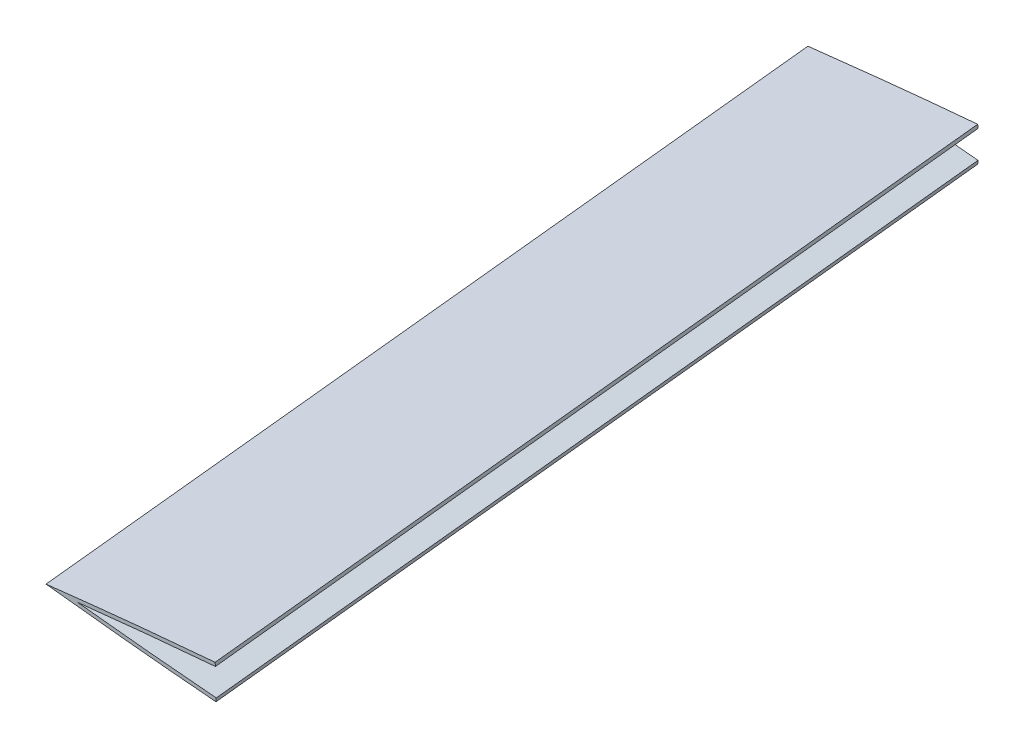
ISO-10303-21;
HEADER;
FILE_DESCRIPTION(('STEP AP214'),'2;1');
FILE_NAME('part.step','',(''),(''),'','','');
FILE_SCHEMA(('AUTOMOTIVE_DESIGN { 1 0 10303 214 1 1 1 1 }'));
ENDSEC;
DATA;
#1=APPLICATION_CONTEXT('core data for automotive mechanical design processes');
#2=APPLICATION_PROTOCOL_DEFINITION('international standard','automotive_design',2000,#1);
#3=PRODUCT_CONTEXT('',#1,'mechanical');
#4=PRODUCT('Part','Part','',(#3));
#5=PRODUCT_RELATED_PRODUCT_CATEGORY('part','',(#4));
#6=PRODUCT_DEFINITION_FORMATION('','',#4);
#7=PRODUCT_DEFINITION_CONTEXT('part definition',#1,'design');
#8=PRODUCT_DEFINITION('design','',#6,#7);
#9=PRODUCT_DEFINITION_SHAPE('','',#8);
#10=(LENGTH_UNIT() NAMED_UNIT(*) SI_UNIT(.MILLI.,.METRE.));
#11=(NAMED_UNIT(*) PLANE_ANGLE_UNIT() SI_UNIT($,.RADIAN.));
#12=(NAMED_UNIT(*) SI_UNIT($,.STERADIAN.) SOLID_ANGLE_UNIT());
#13=UNCERTAINTY_MEASURE_WITH_UNIT(LENGTH_MEASURE(1.E-05),#10,'distance_accuracy_value','');
#14=(GEOMETRIC_REPRESENTATION_CONTEXT(3) GLOBAL_UNCERTAINTY_ASSIGNED_CONTEXT((#13)) GLOBAL_UNIT_ASSIGNED_CONTEXT((#10,
#11,#12)) REPRESENTATION_CONTEXT('',''));
#15=CARTESIAN_POINT('',(0.,0.,0.));
#16=DIRECTION('',(0.,0.,1.));
#17=DIRECTION('',(1.,0.,0.));
#18=AXIS2_PLACEMENT_3D('',#15,#16,#17);
#19=CARTESIAN_POINT('',(-155.991552381173,-13.3439665506031,0.));
#20=DIRECTION('',(0.,0.,-1.));
#21=DIRECTION('',(-1.,0.,0.));
#22=AXIS2_PLACEMENT_3D('',#19,#20,#21);
#23=PLANE('',#22);
#24=CARTESIAN_POINT('',(-186.935066138552,-16.5582164878092,0.));
#25=CARTESIAN_POINT('',(-181.78250778129,-15.9823608234104,0.));
#26=CARTESIAN_POINT('',(-171.472694987605,-14.8792063193787,0.));
#27=CARTESIAN_POINT('',(-155.992989301574,-13.326910598014,0.));
#28=CARTESIAN_POINT('',(-140.50466209314,-11.8769505921837,0.));
#29=CARTESIAN_POINT('',(-130.172520833831,-10.9784626647176,0.));
#30=CARTESIAN_POINT('',(-125.005126122368,-10.5458637463073,0.));
#31=B_SPLINE_CURVE_WITH_KNOTS('',3,(#24,#25,#26,#27,#28,#29,#30),.UNSPECIFIED.,.F.,.F.,(4,1,1,1,
4),(0.0425477915038051,0.100222073223093,0.157896354942381,0.215570636661668,0.273244918380956),.UNSPECIFIED.);
#32=CARTESIAN_POINT('',(-186.935066138552,-16.5582164878092,0.));
#33=VERTEX_POINT('',#32);
#34=CARTESIAN_POINT('',(-125.005126122368,-10.5458637463073,0.));
#35=VERTEX_POINT('',#34);
#36=EDGE_CURVE('E152',#33,#35,#31,.T.);
#37=ORIENTED_EDGE('',*,*,#36,.T.);
#38=DIRECTION('',(-0.0834251922148709,0.996514042702817,0.));
#39=VECTOR('',#38,1.);
#40=CARTESIAN_POINT('',(-125.137563615009,-8.96389770351659,0.));
#41=LINE('',#40,#39);
#42=CARTESIAN_POINT('',(-125.137563615009,-8.96389770351659,0.));
#43=VERTEX_POINT('',#42);
#44=EDGE_CURVE('E12',#35,#43,#41,.T.);
#45=ORIENTED_EDGE('',*,*,#44,.T.);
#46=CARTESIAN_POINT('',(-125.137563615009,-8.96389770351659,0.));
#47=CARTESIAN_POINT('',(-131.488933855494,-9.49561553230214,0.));
#48=CARTESIAN_POINT('',(-144.187668480805,-10.6092758695442,0.));
#49=CARTESIAN_POINT('',(-163.220651588946,-12.4351352726961,0.));
#50=CARTESIAN_POINT('',(-182.242485568744,-14.4129244837602,0.));
#51=CARTESIAN_POINT('',(-194.897509530629,-15.8507244309213,0.));
#52=CARTESIAN_POINT('',(-201.227905683291,-16.5582165600033,0.));
#53=B_SPLINE_CURVE_WITH_KNOTS('',3,(#46,#47,#48,#49,#50,#51,#52),.UNSPECIFIED.,.F.,.F.,(4,1,1,1,
4),(0.0425477915038051,0.11338964124751,0.184231490991215,0.25507334073492,0.325915190478626),.UNSPECIFIED.);
#54=CARTESIAN_POINT('',(-201.227905683291,-16.5582165600033,0.));
#55=VERTEX_POINT('',#54);
#56=EDGE_CURVE('E96',#43,#55,#53,.T.);
#57=ORIENTED_EDGE('',*,*,#56,.T.);
#58=CARTESIAN_POINT('',(-201.227905683291,-16.5582165600033,0.));
#59=CARTESIAN_POINT('',(-194.865975234838,-17.2692329320552,0.));
#60=CARTESIAN_POINT('',(-182.147885323683,-18.7141974203925,0.));
#61=CARTESIAN_POINT('',(-163.031257372277,-20.7004286424456,0.));
#62=CARTESIAN_POINT('',(-143.903351656359,-22.5335129617372,0.));
#63=CARTESIAN_POINT('',(-131.141251001226,-23.6509072376663,0.));
#64=CARTESIAN_POINT('',(-124.758182982807,-24.1842651329411,0.));
#65=B_SPLINE_CURVE_WITH_KNOTS('',3,(#58,#59,#60,#61,#62,#63,#64),.UNSPECIFIED.,.F.,.F.,(4,1,1,1,
4),(0.672674361074974,0.743868822915663,0.815063284756352,0.886257746597041,0.95745220843773),.UNSPECIFIED.);
#66=CARTESIAN_POINT('',(-124.758182982807,-24.1842651329411,0.));
#67=VERTEX_POINT('',#66);
#68=EDGE_CURVE('E347',#55,#67,#65,.T.);
#69=ORIENTED_EDGE('',*,*,#68,.T.);
#70=DIRECTION('',(0.083268052402239,0.996527185504308,0.));
#71=VECTOR('',#70,1.);
#72=CARTESIAN_POINT('',(-124.625994949619,-22.602278225953,0.));
#73=LINE('',#72,#71);
#74=CARTESIAN_POINT('',(-124.625994949619,-22.602278225953,0.));
#75=VERTEX_POINT('',#74);
#76=EDGE_CURVE('E317',#67,#75,#73,.T.);
#77=ORIENTED_EDGE('',*,*,#76,.T.);
#78=CARTESIAN_POINT('',(-124.625994949619,-22.602278225953,0.));
#79=CARTESIAN_POINT('',(-129.82505353968,-22.1678540683216,0.));
#80=CARTESIAN_POINT('',(-140.220497173312,-21.2653230377999,0.));
#81=CARTESIAN_POINT('',(-155.803671625788,-19.8080886198923,0.));
#82=CARTESIAN_POINT('',(-171.378107408449,-18.2472145385064,0.));
#83=CARTESIAN_POINT('',(-181.751000074887,-17.1375934355658,0.));
#84=CARTESIAN_POINT('',(-186.935066138552,-16.5582164878092,0.));
#85=B_SPLINE_CURVE_WITH_KNOTS('',3,(#78,#79,#80,#81,#82,#83,#84),.UNSPECIFIED.,.F.,.F.,(4,1,1,1,
4),(0.725344585849783,0.78337149149677,0.841398397143757,0.899425302790743,0.95745220843773),.UNSPECIFIED.);
#86=EDGE_CURVE('E252',#75,#33,#85,.T.);
#87=ORIENTED_EDGE('',*,*,#86,.T.);
#88=EDGE_LOOP('',(#37,#45,#57,#69,#77,#87));
#89=FACE_BOUND('',#88,.T.);
#90=ADVANCED_FACE('F86',(#89),#23,.F.);
#91=CARTESIAN_POINT('',(-194.0903780932,-13.2698585334843,-381.));
#92=DIRECTION('',(0.,0.,-1.));
#93=DIRECTION('',(-1.,0.,0.));
#94=AXIS2_PLACEMENT_3D('',#91,#92,#93);
#95=PLANE('',#94);
#96=CARTESIAN_POINT('',(-162.897510420268,-10.3559957488798,-381.));
#97=CARTESIAN_POINT('',(-168.099080201454,-10.8114480599009,-381.));
#98=CARTESIAN_POINT('',(-178.499689295412,-11.7521999751358,-381.));
#99=CARTESIAN_POINT('',(-194.091667433046,-13.2551789036517,-381.));
#100=CARTESIAN_POINT('',(-209.6759095316,-14.8462356111636,-381.));
#101=CARTESIAN_POINT('',(-220.055540869867,-15.9739977182134,-381.));
#102=CARTESIAN_POINT('',(-225.243408882229,-16.5582165461435,-381.));
#103=B_SPLINE_CURVE_WITH_KNOTS('',3,(#96,#97,#98,#99,#100,#101,#102),.UNSPECIFIED.,.F.,.F.,(4,1,
1,1,4),(0.0360073361807685,0.0868374020201226,0.137667467859477,0.188497533698831,
0.239327599538185),.UNSPECIFIED.);
#104=CARTESIAN_POINT('',(-162.897510420268,-10.3559957488798,-381.));
#105=VERTEX_POINT('',#104);
#106=CARTESIAN_POINT('',(-225.243408882229,-16.5582165461434,-381.));
#107=VERTEX_POINT('',#106);
#108=EDGE_CURVE('E225',#105,#107,#103,.T.);
#109=ORIENTED_EDGE('',*,*,#108,.T.);
#110=CARTESIAN_POINT('',(-225.243408882229,-16.5582165461434,-381.));
#111=CARTESIAN_POINT('',(-220.055540869867,-17.1424353740746,-381.));
#112=CARTESIAN_POINT('',(-209.6759095316,-18.2701974811266,-381.));
#113=CARTESIAN_POINT('',(-194.091667433046,-19.8612541886419,-381.));
#114=CARTESIAN_POINT('',(-178.499689295412,-21.3642331171611,-381.));
#115=CARTESIAN_POINT('',(-168.099080201454,-22.3049850323982,-381.));
#116=CARTESIAN_POINT('',(-162.897510420268,-22.7604373434204,-381.));
#117=B_SPLINE_CURVE_WITH_KNOTS('',3,(#110,#111,#112,#113,#114,#115,#116),.UNSPECIFIED.,.F.,.F.,
(4,1,1,1,4),(0.760672400461817,0.811502466301171,0.862332532140525,0.913162597979879,
0.963992663819233),.UNSPECIFIED.);
#118=CARTESIAN_POINT('',(-162.897510420268,-22.7604373434204,-381.));
#119=VERTEX_POINT('',#118);
#120=EDGE_CURVE('E217',#107,#119,#117,.T.);
#121=ORIENTED_EDGE('',*,*,#120,.T.);
#122=DIRECTION('',(-0.087226811048304,-0.996188477866685,0.));
#123=VECTOR('',#122,1.);
#124=CARTESIAN_POINT('',(-162.897510420268,-22.7604373434204,-381.));
#125=LINE('',#124,#123);
#126=CARTESIAN_POINT('',(-163.035982982807,-24.3418865520338,-381.));
#127=VERTEX_POINT('',#126);
#128=EDGE_CURVE('E224',#119,#127,#125,.T.);
#129=ORIENTED_EDGE('',*,*,#128,.T.);
#130=CARTESIAN_POINT('',(-163.035982982807,-24.3418865520338,-381.));
#131=CARTESIAN_POINT('',(-169.411756142862,-23.7836203473193,-381.));
#132=CARTESIAN_POINT('',(-182.159568341932,-22.6216012173011,-381.));
#133=CARTESIAN_POINT('',(-201.267276080716,-20.7439366989415,-381.));
#134=CARTESIAN_POINT('',(-220.365379246465,-18.7260639502792,-381.));
#135=CARTESIAN_POINT('',(-233.073011106681,-17.2740396924552,-381.));
#136=CARTESIAN_POINT('',(-239.429526552131,-16.5582165461419,-381.));
#137=B_SPLINE_CURVE_WITH_KNOTS('',3,(#130,#131,#132,#133,#134,#135,#136),.UNSPECIFIED.,.F.,.F.,
(4,1,1,1,4),(0.714921341816295,0.777189172317029,0.839457002817764,0.901724833318498,
0.963992663819233),.UNSPECIFIED.);
#138=CARTESIAN_POINT('',(-239.429526552131,-16.5582165461419,-381.));
#139=VERTEX_POINT('',#138);
#140=EDGE_CURVE('E167',#127,#139,#137,.T.);
#141=ORIENTED_EDGE('',*,*,#140,.T.);
#142=CARTESIAN_POINT('',(-239.429526552131,-16.5582165461419,-381.));
#143=CARTESIAN_POINT('',(-233.073011106681,-15.84239339983,-381.));
#144=CARTESIAN_POINT('',(-220.365379246465,-14.3903691420088,-381.));
#145=CARTESIAN_POINT('',(-201.267276080716,-12.3724963933506,-381.));
#146=CARTESIAN_POINT('',(-182.159568341932,-10.4948318749951,-381.));
#147=CARTESIAN_POINT('',(-169.411756142862,-9.33281274497959,-381.));
#148=CARTESIAN_POINT('',(-163.035982982807,-8.77454654026644,-381.));
#149=B_SPLINE_CURVE_WITH_KNOTS('',3,(#142,#143,#144,#145,#146,#147,#148),.UNSPECIFIED.,.F.,.F.,
(4,1,1,1,4),(0.0360073361807685,0.0982751666815037,0.160542997182239,0.222810827682974,
0.285078658183709),.UNSPECIFIED.);
#150=CARTESIAN_POINT('',(-163.035982982807,-8.77454654026644,-381.));
#151=VERTEX_POINT('',#150);
#152=EDGE_CURVE('E147',#139,#151,#149,.T.);
#153=ORIENTED_EDGE('',*,*,#152,.T.);
#154=DIRECTION('',(0.0872268110480941,-0.996188477866704,0.));
#155=VECTOR('',#154,1.);
#156=CARTESIAN_POINT('',(-162.897510420268,-10.3559957488798,-381.));
#157=LINE('',#156,#155);
#158=EDGE_CURVE('E154',#151,#105,#157,.T.);
#159=ORIENTED_EDGE('',*,*,#158,.T.);
#160=EDGE_LOOP('',(#109,#121,#129,#141,#153,#159));
#161=FACE_BOUND('',#160,.T.);
#162=ADVANCED_FACE('F165',(#161),#95,.T.);
#163=CARTESIAN_POINT('',(-239.429526552131,-16.5582165461419,-381.));
#164=CARTESIAN_POINT('',(-201.227905683291,-16.5582165600033,0.));
#165=CARTESIAN_POINT('',(-235.503800782451,-17.0003023706996,-381.));
#166=CARTESIAN_POINT('',(-197.29870886809,-16.9973479348678,0.));
#167=CARTESIAN_POINT('',(-231.578621940095,-17.4484576280778,-380.999999999999));
#168=CARTESIAN_POINT('',(-193.370128675656,-17.4432165025718,0.));
#169=CARTESIAN_POINT('',(-206.140500552905,-20.297515649726,-380.999999999997));
#170=CARTESIAN_POINT('',(-167.90931098792,-20.2711646842197,0.));
#171=CARTESIAN_POINT('',(-184.599990814583,-22.4537301655892,-381.));
#172=CARTESIAN_POINT('',(-146.346559226257,-22.3803785250621,0.));
#173=CARTESIAN_POINT('',(-163.035982982807,-24.3418865520338,-381.));
#174=CARTESIAN_POINT('',(-124.758182982807,-24.1842651329411,0.));
#175=B_SPLINE_SURFACE_WITH_KNOTS('',3,1,((#163,#164),(#165,#166),(#167,#168),(#169,#170),(#171,
#172),(#173,#174)),.UNSPECIFIED.,.F.,.F.,.F.,(4,1,1,4),(2,2),(0.,0.154334905091122,
0.154340172463882,1.),(0.,1.),.UNSPECIFIED.);
#176=DIRECTION('',(0.0999634317980477,0.000411632277126319,0.994991026523368));
#177=VECTOR('',#176,1.);
#178=CARTESIAN_POINT('',(-143.897082982807,-24.2630758424874,-190.5));
#179=LINE('',#178,#177);
#180=EDGE_CURVE('E243',#127,#67,#179,.T.);
#181=DIRECTION('',(-0.0997664786555587,3.61998926493616E-11,-0.995010879205182));
#182=VECTOR('',#181,1.);
#183=CARTESIAN_POINT('',(-220.328716117711,-16.5582165530726,-190.5));
#184=LINE('',#183,#182);
#185=EDGE_CURVE('E160',#55,#139,#184,.T.);
#186=ORIENTED_EDGE('',*,*,#140,.F.);
#187=ORIENTED_EDGE('',*,*,#180,.T.);
#188=ORIENTED_EDGE('',*,*,#68,.F.);
#189=ORIENTED_EDGE('',*,*,#185,.T.);
#190=EDGE_LOOP('',(#186,#187,#188,#189));
#191=FACE_BOUND('',#190,.T.);
#192=ADVANCED_FACE('F186',(#191),#175,.T.);
#193=CARTESIAN_POINT('',(-163.035982982807,-24.3418865520338,-381.));
#194=CARTESIAN_POINT('',(-124.758182982807,-24.1842651329411,0.));
#195=CARTESIAN_POINT('',(-163.012904222384,-24.0783116839316,-381.));
#196=CARTESIAN_POINT('',(-124.736151643943,-23.9206006484431,0.));
#197=CARTESIAN_POINT('',(-162.989825461961,-23.8147368158293,-381.));
#198=CARTESIAN_POINT('',(-124.714120305078,-23.6569361639451,0.));
#199=CARTESIAN_POINT('',(-162.943667941115,-23.2875870796249,-381.));
#200=CARTESIAN_POINT('',(-124.670057627348,-23.129607194949,0.));
#201=CARTESIAN_POINT('',(-162.920589180691,-23.0240122115226,-381.));
#202=CARTESIAN_POINT('',(-124.648026288483,-22.865942710451,0.));
#203=CARTESIAN_POINT('',(-162.897510420268,-22.7604373434204,-381.));
#204=CARTESIAN_POINT('',(-124.625994949619,-22.602278225953,0.));
#205=B_SPLINE_SURFACE_WITH_KNOTS('',3,1,((#193,#194),(#195,#196),(#197,#198),(#199,#200),(#201,
#202),(#203,#204)),.UNSPECIFIED.,.F.,.F.,.F.,(4,2,4),(2,2),(0.,0.5,1.),(0.,1.),.UNSPECIFIED.);
#206=DIRECTION('',(0.0999471834967008,0.000413037167219505,0.994992658219836));
#207=VECTOR('',#206,1.);
#208=CARTESIAN_POINT('',(-143.761752684943,-22.6813577846867,-190.5));
#209=LINE('',#208,#207);
#210=EDGE_CURVE('E241',#119,#75,#209,.T.);
#211=ORIENTED_EDGE('',*,*,#128,.F.);
#212=ORIENTED_EDGE('',*,*,#210,.T.);
#213=ORIENTED_EDGE('',*,*,#76,.F.);
#214=ORIENTED_EDGE('',*,*,#180,.F.);
#215=EDGE_LOOP('',(#211,#212,#213,#214));
#216=FACE_BOUND('',#215,.T.);
#217=ADVANCED_FACE('F239',(#216),#205,.T.);
#218=CARTESIAN_POINT('',(-163.035982982807,-8.77454654026644,-381.));
#219=CARTESIAN_POINT('',(-125.137563615009,-8.96389770351659,0.));
#220=CARTESIAN_POINT('',(-184.974819842377,-10.6955231625444,-381.));
#221=CARTESIAN_POINT('',(-146.992102149548,-10.7934946784534,0.));
#222=CARTESIAN_POINT('',(-206.890832913121,-12.8786884240055,-380.999999999999));
#223=CARTESIAN_POINT('',(-168.821870130078,-12.9203329461564,0.));
#224=CARTESIAN_POINT('',(-228.774191867222,-15.3546444906703,-381.000000000001));
#225=CARTESIAN_POINT('',(-190.616023235515,-15.3681733452593,0.));
#226=CARTESIAN_POINT('',(-228.774325799014,-15.3546596441588,-381.000000000001));
#227=CARTESIAN_POINT('',(-190.616156621343,-15.3681883266849,0.));
#228=CARTESIAN_POINT('',(-232.326086524204,-15.7565176647242,-381.000000000001));
#229=CARTESIAN_POINT('',(-194.153438793933,-15.7654837038154,0.));
#230=CARTESIAN_POINT('',(-235.877701009115,-16.1582365638432,-381.));
#231=CARTESIAN_POINT('',(-197.690550043949,-16.1628777514603,0.));
#232=CARTESIAN_POINT('',(-239.429526552131,-16.5582165461419,-381.));
#233=CARTESIAN_POINT('',(-201.227905683291,-16.5582165600033,0.));
#234=B_SPLINE_SURFACE_WITH_KNOTS('',3,1,((#218,#219),(#220,#221),(#222,#223),(#224,#225),(#226,
#227),(#228,#229),(#230,#231),(#232,#233)),.UNSPECIFIED.,.F.,.F.,.F.,(4,2,2,4),(2,2),(0.,
0.860359240565393,0.860364506217715,1.),(0.,1.),.UNSPECIFIED.);
#235=DIRECTION('',(0.0989824211903576,-0.000494544018097924,0.995089059190939));
#236=VECTOR('',#235,1.);
#237=CARTESIAN_POINT('',(-144.086773298908,-8.86922212189151,-190.5));
#238=LINE('',#237,#236);
#239=EDGE_CURVE('E142',#151,#43,#238,.T.);
#240=ORIENTED_EDGE('',*,*,#152,.F.);
#241=ORIENTED_EDGE('',*,*,#185,.F.);
#242=ORIENTED_EDGE('',*,*,#56,.F.);
#243=ORIENTED_EDGE('',*,*,#239,.F.);
#244=EDGE_LOOP('',(#240,#241,#242,#243));
#245=FACE_BOUND('',#244,.T.);
#246=ADVANCED_FACE('F144',(#245),#234,.T.);
#247=CARTESIAN_POINT('',(-162.897510420268,-22.7604373434204,-381.));
#248=CARTESIAN_POINT('',(-124.625994949619,-22.602278225953,0.));
#249=CARTESIAN_POINT('',(-173.300896827851,-21.8495111074735,-381.));
#250=CARTESIAN_POINT('',(-135.024597261563,-21.7333893739316,0.));
#251=CARTESIAN_POINT('',(-183.698393358019,-20.880230444682,-381.));
#252=CARTESIAN_POINT('',(-145.416646648264,-20.7985582090834,0.));
#253=CARTESIAN_POINT('',(-204.481606663525,-18.8249602654099,-381.));
#254=CARTESIAN_POINT('',(-166.187639571178,-18.7970112537332,0.));
#255=CARTESIAN_POINT('',(-214.866076287344,-17.7268339957757,-381.));
#256=CARTESIAN_POINT('',(-176.565280580789,-17.7171551725335,0.));
#257=CARTESIAN_POINT('',(-225.243408882229,-16.5582165461434,-381.));
#258=CARTESIAN_POINT('',(-186.935066138552,-16.5582164878092,0.));
#259=B_SPLINE_SURFACE_WITH_KNOTS('',3,1,((#247,#248),(#249,#250),(#251,#252),(#253,#254),(#255,
#256),(#257,#258)),.UNSPECIFIED.,.F.,.F.,.F.,(4,2,4),(2,2),(0.,0.5,1.),(0.,1.),.UNSPECIFIED.);
#260=DIRECTION('',(0.100042405419549,1.52340224336902E-10,0.994983174288827));
#261=VECTOR('',#260,1.);
#262=CARTESIAN_POINT('',(-206.08923751039,-16.5582165169763,-190.5));
#263=LINE('',#262,#261);
#264=EDGE_CURVE('E254',#107,#33,#263,.T.);
#265=ORIENTED_EDGE('',*,*,#120,.F.);
#266=ORIENTED_EDGE('',*,*,#264,.T.);
#267=ORIENTED_EDGE('',*,*,#86,.F.);
#268=ORIENTED_EDGE('',*,*,#210,.F.);
#269=EDGE_LOOP('',(#265,#266,#267,#268));
#270=FACE_BOUND('',#269,.T.);
#271=ADVANCED_FACE('F248',(#270),#259,.T.);
#272=CARTESIAN_POINT('',(-225.243408882229,-16.5582165461435,-381.));
#273=CARTESIAN_POINT('',(-186.935066138552,-16.5582164878092,0.));
#274=CARTESIAN_POINT('',(-214.86603803275,-15.3895947885676,-381.));
#275=CARTESIAN_POINT('',(-176.628344091785,-15.406325745291,0.));
#276=CARTESIAN_POINT('',(-204.481545637824,-14.291466285497,-381.));
#277=CARTESIAN_POINT('',(-166.313825609569,-14.3326038871004,0.));
#278=CARTESIAN_POINT('',(-183.69831775708,-12.2361957883658,-381.));
#279=CARTESIAN_POINT('',(-145.669195774236,-12.3414979393744,0.));
#280=CARTESIAN_POINT('',(-173.300843998019,-11.2669173590153,-381.));
#281=CARTESIAN_POINT('',(-135.340400917725,-11.4111022170643,0.));
#282=CARTESIAN_POINT('',(-162.897510420268,-10.3559957488798,-381.));
#283=CARTESIAN_POINT('',(-125.005126122368,-10.5458637463073,0.));
#284=B_SPLINE_SURFACE_WITH_KNOTS('',3,1,((#272,#273),(#274,#275),(#276,#277),(#278,#279),(#280,
#281),(#282,#283)),.UNSPECIFIED.,.F.,.F.,.F.,(4,2,4),(2,2),(0.,0.5,1.),(0.,1.),.UNSPECIFIED.);
#285=DIRECTION('',(0.0989668132302265,-0.000495894649755368,0.995090610933271));
#286=VECTOR('',#285,1.);
#287=CARTESIAN_POINT('',(-143.951318271318,-10.4509297475936,-190.5));
#288=LINE('',#287,#286);
#289=EDGE_CURVE('E104',#105,#35,#288,.T.);
#290=ORIENTED_EDGE('',*,*,#108,.F.);
#291=ORIENTED_EDGE('',*,*,#289,.T.);
#292=ORIENTED_EDGE('',*,*,#36,.F.);
#293=ORIENTED_EDGE('',*,*,#264,.F.);
#294=EDGE_LOOP('',(#290,#291,#292,#293));
#295=FACE_BOUND('',#294,.T.);
#296=ADVANCED_FACE('F278',(#295),#284,.T.);
#297=CARTESIAN_POINT('',(-162.897510420268,-10.3559957488798,-381.));
#298=CARTESIAN_POINT('',(-125.005126122368,-10.5458637463073,0.));
#299=CARTESIAN_POINT('',(-162.920589180691,-10.0924208807776,-381.));
#300=CARTESIAN_POINT('',(-125.027199037808,-10.2822027391755,0.));
#301=CARTESIAN_POINT('',(-162.943667941115,-9.82884601267537,-381.));
#302=CARTESIAN_POINT('',(-125.049271953248,-10.0185417320437,0.));
#303=CARTESIAN_POINT('',(-162.989825461961,-9.30169627647091,-381.));
#304=CARTESIAN_POINT('',(-125.093417784128,-9.49121971778014,0.));
#305=CARTESIAN_POINT('',(-163.012904222384,-9.03812140836868,-381.));
#306=CARTESIAN_POINT('',(-125.115490699569,-9.22755871064836,0.));
#307=CARTESIAN_POINT('',(-163.035982982807,-8.77454654026644,-381.));
#308=CARTESIAN_POINT('',(-125.137563615009,-8.96389770351659,0.));
#309=B_SPLINE_SURFACE_WITH_KNOTS('',3,1,((#297,#298),(#299,#300),(#301,#302),(#303,#304),(#305,
#306),(#307,#308)),.UNSPECIFIED.,.F.,.F.,.F.,(4,2,4),(2,2),(0.,0.5,1.),(0.,1.),.UNSPECIFIED.);
#310=ORIENTED_EDGE('',*,*,#158,.F.);
#311=ORIENTED_EDGE('',*,*,#239,.T.);
#312=ORIENTED_EDGE('',*,*,#44,.F.);
#313=ORIENTED_EDGE('',*,*,#289,.F.);
#314=EDGE_LOOP('',(#310,#311,#312,#313));
#315=FACE_BOUND('',#314,.T.);
#316=ADVANCED_FACE('F156',(#315),#309,.T.);
#317=CLOSED_SHELL('',(#90,#162,#192,#217,#246,#271,#296,#316));
#318=MANIFOLD_SOLID_BREP('B2',#317);
#319=ADVANCED_BREP_SHAPE_REPRESENTATION('',(#18,#318),#14);
#320=SHAPE_DEFINITION_REPRESENTATION(#9,#319);
ENDSEC;
END-ISO-10303-21;
